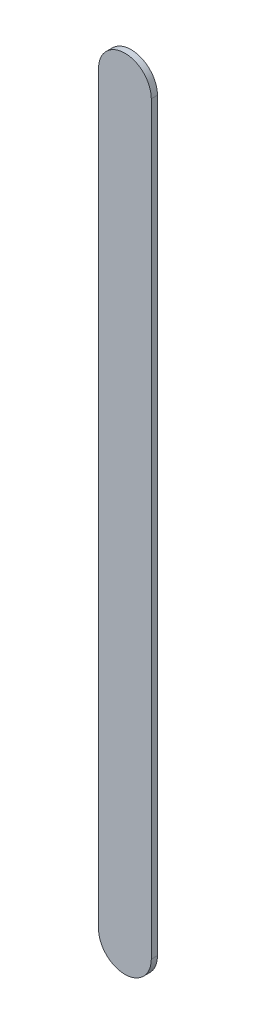
ISO-10303-21;
HEADER;
FILE_DESCRIPTION(('STEP AP214'),'2;1');
FILE_NAME('part.step','',(''),(''),'','','');
FILE_SCHEMA(('AUTOMOTIVE_DESIGN { 1 0 10303 214 1 1 1 1 }'));
ENDSEC;
DATA;
#1=APPLICATION_CONTEXT('core data for automotive mechanical design processes');
#2=APPLICATION_PROTOCOL_DEFINITION('international standard','automotive_design',2000,#1);
#3=PRODUCT_CONTEXT('',#1,'mechanical');
#4=PRODUCT('Part','Part','',(#3));
#5=PRODUCT_RELATED_PRODUCT_CATEGORY('part','',(#4));
#6=PRODUCT_DEFINITION_FORMATION('','',#4);
#7=PRODUCT_DEFINITION_CONTEXT('part definition',#1,'design');
#8=PRODUCT_DEFINITION('design','',#6,#7);
#9=PRODUCT_DEFINITION_SHAPE('','',#8);
#10=(LENGTH_UNIT() NAMED_UNIT(*) SI_UNIT(.MILLI.,.METRE.));
#11=(NAMED_UNIT(*) PLANE_ANGLE_UNIT() SI_UNIT($,.RADIAN.));
#12=(NAMED_UNIT(*) SI_UNIT($,.STERADIAN.) SOLID_ANGLE_UNIT());
#13=UNCERTAINTY_MEASURE_WITH_UNIT(LENGTH_MEASURE(1.E-05),#10,'distance_accuracy_value','');
#14=(GEOMETRIC_REPRESENTATION_CONTEXT(3) GLOBAL_UNCERTAINTY_ASSIGNED_CONTEXT((#13)) GLOBAL_UNIT_ASSIGNED_CONTEXT((#10,
#11,#12)) REPRESENTATION_CONTEXT('',''));
#15=CARTESIAN_POINT('',(0.,0.,0.));
#16=DIRECTION('',(0.,0.,1.));
#17=DIRECTION('',(1.,0.,0.));
#18=AXIS2_PLACEMENT_3D('',#15,#16,#17);
#19=CARTESIAN_POINT('',(94.15,-134.1,1.635));
#20=DIRECTION('',(0.,0.,1.));
#21=DIRECTION('',(1.,0.,0.));
#22=AXIS2_PLACEMENT_3D('',#19,#20,#21);
#23=PLANE('',#22);
#24=DIRECTION('',(0.,1.,0.));
#25=VECTOR('',#24,1.);
#26=CARTESIAN_POINT('',(94.15,-134.1,1.635));
#27=LINE('',#26,#25);
#28=CARTESIAN_POINT('',(94.15,-134.1,1.635));
#29=VERTEX_POINT('',#28);
#30=CARTESIAN_POINT('',(94.15,-129.86066,1.635));
#31=VERTEX_POINT('',#30);
#32=EDGE_CURVE('E92',#29,#31,#27,.T.);
#33=ORIENTED_EDGE('',*,*,#32,.T.);
#34=CARTESIAN_POINT('',(94.,-129.86066,1.635));
#35=DIRECTION('',(0.,0.,1.));
#36=DIRECTION('',(1.,0.,0.));
#37=AXIS2_PLACEMENT_3D('',#34,#35,#36);
#38=CIRCLE('',#37,0.15);
#39=CARTESIAN_POINT('',(93.85,-129.86066,1.635));
#40=VERTEX_POINT('',#39);
#41=EDGE_CURVE('E72',#31,#40,#38,.T.);
#42=ORIENTED_EDGE('',*,*,#41,.T.);
#43=DIRECTION('',(0.,-1.,0.));
#44=VECTOR('',#43,1.);
#45=CARTESIAN_POINT('',(93.85,-129.86066,1.635));
#46=LINE('',#45,#44);
#47=CARTESIAN_POINT('',(93.85,-134.1,1.635));
#48=VERTEX_POINT('',#47);
#49=EDGE_CURVE('E86',#40,#48,#46,.T.);
#50=ORIENTED_EDGE('',*,*,#49,.T.);
#51=CARTESIAN_POINT('',(94.,-134.1,1.635));
#52=DIRECTION('',(0.,0.,1.));
#53=DIRECTION('',(-1.,1.894780628694E-13,0.));
#54=AXIS2_PLACEMENT_3D('',#51,#52,#53);
#55=CIRCLE('',#54,0.15);
#56=EDGE_CURVE('E11',#48,#29,#55,.T.);
#57=ORIENTED_EDGE('',*,*,#56,.T.);
#58=EDGE_LOOP('',(#33,#42,#50,#57));
#59=FACE_BOUND('',#58,.T.);
#60=ADVANCED_FACE('F17',(#59),#23,.T.);
#61=CARTESIAN_POINT('',(94.15,-134.1,1.6));
#62=DIRECTION('',(0.,0.,1.));
#63=DIRECTION('',(1.,0.,0.));
#64=AXIS2_PLACEMENT_3D('',#61,#62,#63);
#65=PLANE('',#64);
#66=CARTESIAN_POINT('',(94.,-134.1,1.6));
#67=DIRECTION('',(0.,0.,1.));
#68=DIRECTION('',(-1.,1.894780628694E-13,0.));
#69=AXIS2_PLACEMENT_3D('',#66,#67,#68);
#70=CIRCLE('',#69,0.15);
#71=CARTESIAN_POINT('',(93.85,-134.1,1.6));
#72=VERTEX_POINT('',#71);
#73=CARTESIAN_POINT('',(94.15,-134.1,1.6));
#74=VERTEX_POINT('',#73);
#75=EDGE_CURVE('E25',#72,#74,#70,.T.);
#76=ORIENTED_EDGE('',*,*,#75,.F.);
#77=DIRECTION('',(0.,-1.,0.));
#78=VECTOR('',#77,1.);
#79=CARTESIAN_POINT('',(93.85,-129.86066,1.6));
#80=LINE('',#79,#78);
#81=CARTESIAN_POINT('',(93.85,-129.86066,1.6));
#82=VERTEX_POINT('',#81);
#83=EDGE_CURVE('E57',#82,#72,#80,.T.);
#84=ORIENTED_EDGE('',*,*,#83,.F.);
#85=CARTESIAN_POINT('',(94.,-129.86066,1.6));
#86=DIRECTION('',(0.,0.,1.));
#87=DIRECTION('',(1.,0.,0.));
#88=AXIS2_PLACEMENT_3D('',#85,#86,#87);
#89=CIRCLE('',#88,0.15);
#90=CARTESIAN_POINT('',(94.15,-129.86066,1.6));
#91=VERTEX_POINT('',#90);
#92=EDGE_CURVE('E94',#91,#82,#89,.T.);
#93=ORIENTED_EDGE('',*,*,#92,.F.);
#94=DIRECTION('',(0.,1.,0.));
#95=VECTOR('',#94,1.);
#96=CARTESIAN_POINT('',(94.15,-134.1,1.6));
#97=LINE('',#96,#95);
#98=EDGE_CURVE('E91',#74,#91,#97,.T.);
#99=ORIENTED_EDGE('',*,*,#98,.F.);
#100=EDGE_LOOP('',(#76,#84,#93,#99));
#101=FACE_BOUND('',#100,.T.);
#102=ADVANCED_FACE('F96',(#101),#65,.F.);
#103=CARTESIAN_POINT('',(94.,-134.1,1.6));
#104=DIRECTION('',(0.,0.,-1.));
#105=DIRECTION('',(-1.,1.894780628694E-13,0.));
#106=AXIS2_PLACEMENT_3D('',#103,#104,#105);
#107=CYLINDRICAL_SURFACE('',#106,0.15);
#108=ORIENTED_EDGE('',*,*,#75,.T.);
#109=DIRECTION('',(0.,0.,1.));
#110=VECTOR('',#109,1.);
#111=CARTESIAN_POINT('',(94.15,-134.1,1.6));
#112=LINE('',#111,#110);
#113=EDGE_CURVE('E81',#74,#29,#112,.T.);
#114=ORIENTED_EDGE('',*,*,#113,.T.);
#115=ORIENTED_EDGE('',*,*,#56,.F.);
#116=DIRECTION('',(0.,0.,1.));
#117=VECTOR('',#116,1.);
#118=CARTESIAN_POINT('',(93.85,-134.1,1.6));
#119=LINE('',#118,#117);
#120=EDGE_CURVE('E84',#72,#48,#119,.T.);
#121=ORIENTED_EDGE('',*,*,#120,.F.);
#122=EDGE_LOOP('',(#108,#114,#115,#121));
#123=FACE_BOUND('',#122,.T.);
#124=ADVANCED_FACE('F80',(#123),#107,.T.);
#125=CARTESIAN_POINT('',(93.85,-129.86066,1.6));
#126=DIRECTION('',(1.,0.,0.));
#127=DIRECTION('',(0.,1.,0.));
#128=AXIS2_PLACEMENT_3D('',#125,#126,#127);
#129=PLANE('',#128);
#130=ORIENTED_EDGE('',*,*,#83,.T.);
#131=ORIENTED_EDGE('',*,*,#120,.T.);
#132=ORIENTED_EDGE('',*,*,#49,.F.);
#133=DIRECTION('',(0.,0.,1.));
#134=VECTOR('',#133,1.);
#135=CARTESIAN_POINT('',(93.85,-129.86066,1.6));
#136=LINE('',#135,#134);
#137=EDGE_CURVE('E107',#82,#40,#136,.T.);
#138=ORIENTED_EDGE('',*,*,#137,.F.);
#139=EDGE_LOOP('',(#130,#131,#132,#138));
#140=FACE_BOUND('',#139,.T.);
#141=ADVANCED_FACE('F124',(#140),#129,.F.);
#142=CARTESIAN_POINT('',(94.,-129.86066,1.6));
#143=DIRECTION('',(0.,0.,-1.));
#144=DIRECTION('',(1.,0.,0.));
#145=AXIS2_PLACEMENT_3D('',#142,#143,#144);
#146=CYLINDRICAL_SURFACE('',#145,0.15);
#147=ORIENTED_EDGE('',*,*,#92,.T.);
#148=ORIENTED_EDGE('',*,*,#137,.T.);
#149=ORIENTED_EDGE('',*,*,#41,.F.);
#150=DIRECTION('',(0.,0.,1.));
#151=VECTOR('',#150,1.);
#152=CARTESIAN_POINT('',(94.15,-129.86066,1.6));
#153=LINE('',#152,#151);
#154=EDGE_CURVE('E99',#91,#31,#153,.T.);
#155=ORIENTED_EDGE('',*,*,#154,.F.);
#156=EDGE_LOOP('',(#147,#148,#149,#155));
#157=FACE_BOUND('',#156,.T.);
#158=ADVANCED_FACE('F125',(#157),#146,.T.);
#159=CARTESIAN_POINT('',(94.15,-134.1,1.6));
#160=DIRECTION('',(-1.,0.,0.));
#161=DIRECTION('',(0.,0.,1.));
#162=AXIS2_PLACEMENT_3D('',#159,#160,#161);
#163=PLANE('',#162);
#164=ORIENTED_EDGE('',*,*,#98,.T.);
#165=ORIENTED_EDGE('',*,*,#154,.T.);
#166=ORIENTED_EDGE('',*,*,#32,.F.);
#167=ORIENTED_EDGE('',*,*,#113,.F.);
#168=EDGE_LOOP('',(#164,#165,#166,#167));
#169=FACE_BOUND('',#168,.T.);
#170=ADVANCED_FACE('F89',(#169),#163,.F.);
#171=CLOSED_SHELL('',(#60,#102,#124,#141,#158,#170));
#172=MANIFOLD_SOLID_BREP('B1',#171);
#173=ADVANCED_BREP_SHAPE_REPRESENTATION('',(#18,#172),#14);
#174=SHAPE_DEFINITION_REPRESENTATION(#9,#173);
ENDSEC;
END-ISO-10303-21;
